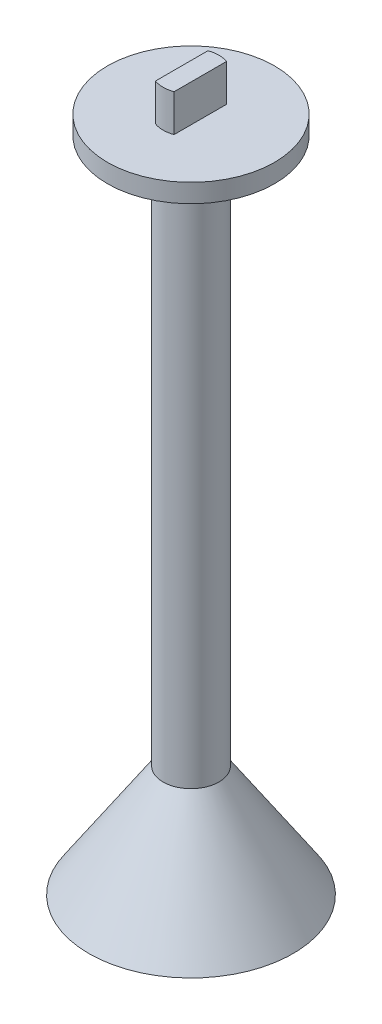
ISO-10303-21;
HEADER;
FILE_DESCRIPTION(('STEP AP214'),'2;1');
FILE_NAME('part.step','',(''),(''),'','','');
FILE_SCHEMA(('AUTOMOTIVE_DESIGN { 1 0 10303 214 1 1 1 1 }'));
ENDSEC;
DATA;
#1=APPLICATION_CONTEXT('core data for automotive mechanical design processes');
#2=APPLICATION_PROTOCOL_DEFINITION('international standard','automotive_design',2000,#1);
#3=PRODUCT_CONTEXT('',#1,'mechanical');
#4=PRODUCT('Part','Part','',(#3));
#5=PRODUCT_RELATED_PRODUCT_CATEGORY('part','',(#4));
#6=PRODUCT_DEFINITION_FORMATION('','',#4);
#7=PRODUCT_DEFINITION_CONTEXT('part definition',#1,'design');
#8=PRODUCT_DEFINITION('design','',#6,#7);
#9=PRODUCT_DEFINITION_SHAPE('','',#8);
#10=(LENGTH_UNIT() NAMED_UNIT(*) SI_UNIT(.MILLI.,.METRE.));
#11=(NAMED_UNIT(*) PLANE_ANGLE_UNIT() SI_UNIT($,.RADIAN.));
#12=(NAMED_UNIT(*) SI_UNIT($,.STERADIAN.) SOLID_ANGLE_UNIT());
#13=UNCERTAINTY_MEASURE_WITH_UNIT(LENGTH_MEASURE(1.E-05),#10,'distance_accuracy_value','');
#14=(GEOMETRIC_REPRESENTATION_CONTEXT(3) GLOBAL_UNCERTAINTY_ASSIGNED_CONTEXT((#13)) GLOBAL_UNIT_ASSIGNED_CONTEXT((#10,
#11,#12)) REPRESENTATION_CONTEXT('',''));
#15=CARTESIAN_POINT('',(0.,0.,0.));
#16=DIRECTION('',(0.,0.,1.));
#17=DIRECTION('',(1.,0.,0.));
#18=AXIS2_PLACEMENT_3D('',#15,#16,#17);
#19=CARTESIAN_POINT('',(0.,192.,0.));
#20=DIRECTION('',(0.,1.,0.));
#21=DIRECTION('',(0.,0.,1.));
#22=AXIS2_PLACEMENT_3D('',#19,#20,#21);
#23=PLANE('',#22);
#24=DIRECTION('',(0.,0.,1.));
#25=VECTOR('',#24,1.);
#26=CARTESIAN_POINT('',(2.5,192.,0.));
#27=LINE('',#26,#25);
#28=CARTESIAN_POINT('',(2.5,192.,-7.07106781186548));
#29=VERTEX_POINT('',#28);
#30=CARTESIAN_POINT('',(2.5,192.,7.07106781186548));
#31=VERTEX_POINT('',#30);
#32=EDGE_CURVE('E89',#29,#31,#27,.T.);
#33=ORIENTED_EDGE('',*,*,#32,.F.);
#34=CARTESIAN_POINT('',(0.,192.,0.));
#35=DIRECTION('',(0.,1.,0.));
#36=DIRECTION('',(0.,0.,1.));
#37=AXIS2_PLACEMENT_3D('',#34,#35,#36);
#38=CIRCLE('',#37,7.5);
#39=CARTESIAN_POINT('',(-2.5,192.,-7.07106781186548));
#40=VERTEX_POINT('',#39);
#41=EDGE_CURVE('E101',#29,#40,#38,.T.);
#42=ORIENTED_EDGE('',*,*,#41,.T.);
#43=DIRECTION('',(0.,0.,1.));
#44=VECTOR('',#43,1.);
#45=CARTESIAN_POINT('',(-2.5,192.,0.));
#46=LINE('',#45,#44);
#47=CARTESIAN_POINT('',(-2.5,192.,7.07106781186548));
#48=VERTEX_POINT('',#47);
#49=EDGE_CURVE('E220',#40,#48,#46,.T.);
#50=ORIENTED_EDGE('',*,*,#49,.T.);
#51=EDGE_CURVE('E103',#48,#31,#38,.T.);
#52=ORIENTED_EDGE('',*,*,#51,.T.);
#53=EDGE_LOOP('',(#33,#42,#50,#52));
#54=FACE_BOUND('',#53,.T.);
#55=ADVANCED_FACE('F44',(#54),#23,.T.);
#56=CARTESIAN_POINT('',(0.,192.,0.));
#57=DIRECTION('',(0.,-1.,0.));
#58=DIRECTION('',(0.,0.,-1.));
#59=AXIS2_PLACEMENT_3D('',#56,#57,#58);
#60=CYLINDRICAL_SURFACE('',#59,7.5);
#61=ORIENTED_EDGE('',*,*,#41,.F.);
#62=DIRECTION('',(0.,1.,0.));
#63=VECTOR('',#62,1.);
#64=CARTESIAN_POINT('',(2.5,182.,-7.07106781186548));
#65=LINE('',#64,#63);
#66=CARTESIAN_POINT('',(2.5,182.,-7.07106781186548));
#67=VERTEX_POINT('',#66);
#68=EDGE_CURVE('E86',#67,#29,#65,.T.);
#69=ORIENTED_EDGE('',*,*,#68,.F.);
#70=CARTESIAN_POINT('',(0.,182.,0.));
#71=DIRECTION('',(0.,1.,0.));
#72=DIRECTION('',(0.,0.,1.));
#73=AXIS2_PLACEMENT_3D('',#70,#71,#72);
#74=CIRCLE('',#73,7.5);
#75=CARTESIAN_POINT('',(-2.5,182.,-7.07106781186548));
#76=VERTEX_POINT('',#75);
#77=EDGE_CURVE('E117',#67,#76,#74,.T.);
#78=ORIENTED_EDGE('',*,*,#77,.T.);
#79=DIRECTION('',(0.,1.,0.));
#80=VECTOR('',#79,1.);
#81=CARTESIAN_POINT('',(-2.5,182.,-7.07106781186548));
#82=LINE('',#81,#80);
#83=EDGE_CURVE('E109',#76,#40,#82,.T.);
#84=ORIENTED_EDGE('',*,*,#83,.T.);
#85=EDGE_LOOP('',(#61,#69,#78,#84));
#86=FACE_BOUND('',#85,.T.);
#87=ADVANCED_FACE('F108',(#86),#60,.T.);
#88=CARTESIAN_POINT('',(-2.5,182.,7.07106781186548));
#89=VERTEX_POINT('',#88);
#90=CARTESIAN_POINT('',(2.5,182.,7.07106781186548));
#91=VERTEX_POINT('',#90);
#92=EDGE_CURVE('E49',#89,#91,#74,.T.);
#93=ORIENTED_EDGE('',*,*,#92,.T.);
#94=DIRECTION('',(0.,1.,0.));
#95=VECTOR('',#94,1.);
#96=CARTESIAN_POINT('',(2.5,182.,7.07106781186548));
#97=LINE('',#96,#95);
#98=EDGE_CURVE('E95',#91,#31,#97,.T.);
#99=ORIENTED_EDGE('',*,*,#98,.T.);
#100=ORIENTED_EDGE('',*,*,#51,.F.);
#101=DIRECTION('',(0.,1.,0.));
#102=VECTOR('',#101,1.);
#103=CARTESIAN_POINT('',(-2.5,182.,7.07106781186548));
#104=LINE('',#103,#102);
#105=EDGE_CURVE('E105',#89,#48,#104,.T.);
#106=ORIENTED_EDGE('',*,*,#105,.F.);
#107=EDGE_LOOP('',(#93,#99,#100,#106));
#108=FACE_BOUND('',#107,.T.);
#109=ADVANCED_FACE('F184',(#108),#60,.T.);
#110=CARTESIAN_POINT('',(0.,30.,0.));
#111=DIRECTION('',(0.,1.,0.));
#112=DIRECTION('',(0.,0.,1.));
#113=AXIS2_PLACEMENT_3D('',#110,#111,#112);
#114=CIRCLE('',#113,7.5);
#115=CARTESIAN_POINT('',(0.,30.,-7.5));
#116=VERTEX_POINT('',#115);
#117=EDGE_CURVE('E111',#116,#116,#114,.T.);
#118=ORIENTED_EDGE('',*,*,#117,.T.);
#119=EDGE_LOOP('',(#118));
#120=FACE_BOUND('',#119,.T.);
#121=CARTESIAN_POINT('',(0.,177.,0.));
#122=DIRECTION('',(0.,1.,0.));
#123=DIRECTION('',(0.,0.,1.));
#124=AXIS2_PLACEMENT_3D('',#121,#122,#123);
#125=CIRCLE('',#124,7.5);
#126=CARTESIAN_POINT('',(0.,177.,7.5));
#127=VERTEX_POINT('',#126);
#128=EDGE_CURVE('E12',#127,#127,#125,.T.);
#129=ORIENTED_EDGE('',*,*,#128,.F.);
#130=EDGE_LOOP('',(#129));
#131=FACE_BOUND('',#130,.T.);
#132=ADVANCED_FACE('F179',(#120,#131),#60,.T.);
#133=CARTESIAN_POINT('',(0.,0.,0.));
#134=DIRECTION('',(0.,1.,0.));
#135=DIRECTION('',(0.,0.,1.));
#136=AXIS2_PLACEMENT_3D('',#133,#134,#135);
#137=PLANE('',#136);
#138=CARTESIAN_POINT('',(0.,0.,0.));
#139=DIRECTION('',(0.,-1.,0.));
#140=DIRECTION('',(0.,0.,-1.));
#141=AXIS2_PLACEMENT_3D('',#138,#139,#140);
#142=CIRCLE('',#141,5.);
#143=CARTESIAN_POINT('',(0.,0.,-5.));
#144=VERTEX_POINT('',#143);
#145=EDGE_CURVE('E221',#144,#144,#142,.T.);
#146=ORIENTED_EDGE('',*,*,#145,.F.);
#147=EDGE_LOOP('',(#146));
#148=FACE_BOUND('',#147,.T.);
#149=CARTESIAN_POINT('',(0.,0.,0.));
#150=DIRECTION('',(0.,1.,0.));
#151=DIRECTION('',(0.,0.,1.));
#152=AXIS2_PLACEMENT_3D('',#149,#150,#151);
#153=CIRCLE('',#152,27.5);
#154=CARTESIAN_POINT('',(0.,0.,-27.5));
#155=VERTEX_POINT('',#154);
#156=EDGE_CURVE('E55',#155,#155,#153,.T.);
#157=ORIENTED_EDGE('',*,*,#156,.F.);
#158=EDGE_LOOP('',(#157));
#159=FACE_BOUND('',#158,.T.);
#160=ADVANCED_FACE('F46',(#148,#159),#137,.F.);
#161=CARTESIAN_POINT('',(0.,30.,0.));
#162=DIRECTION('',(0.,-1.,0.));
#163=DIRECTION('',(0.,0.,-1.));
#164=AXIS2_PLACEMENT_3D('',#161,#162,#163);
#165=CONICAL_SURFACE('',#164,7.5,0.588002603547568);
#166=CARTESIAN_POINT('',(0.,30.,-7.5));
#167=CARTESIAN_POINT('',(0.,29.6875,-7.70833333333334));
#168=CARTESIAN_POINT('',(0.,29.375,-7.91666666666667));
#169=CARTESIAN_POINT('',(0.,28.75,-8.33333333333334));
#170=CARTESIAN_POINT('',(0.,28.4375,-8.54166666666667));
#171=CARTESIAN_POINT('',(0.,27.8125,-8.95833333333333));
#172=CARTESIAN_POINT('',(0.,27.5,-9.16666666666667));
#173=CARTESIAN_POINT('',(0.,26.875,-9.58333333333333));
#174=CARTESIAN_POINT('',(0.,26.5625,-9.79166666666667));
#175=CARTESIAN_POINT('',(0.,25.9375,-10.2083333333333));
#176=CARTESIAN_POINT('',(0.,25.625,-10.4166666666667));
#177=CARTESIAN_POINT('',(0.,25.,-10.8333333333333));
#178=CARTESIAN_POINT('',(0.,24.6875,-11.0416666666667));
#179=CARTESIAN_POINT('',(0.,24.0625,-11.4583333333333));
#180=CARTESIAN_POINT('',(0.,23.75,-11.6666666666667));
#181=CARTESIAN_POINT('',(0.,23.125,-12.0833333333333));
#182=CARTESIAN_POINT('',(0.,22.8125,-12.2916666666667));
#183=CARTESIAN_POINT('',(0.,22.1875,-12.7083333333333));
#184=CARTESIAN_POINT('',(0.,21.875,-12.9166666666667));
#185=CARTESIAN_POINT('',(0.,21.25,-13.3333333333333));
#186=CARTESIAN_POINT('',(0.,20.9375,-13.5416666666667));
#187=CARTESIAN_POINT('',(0.,20.3125,-13.9583333333333));
#188=CARTESIAN_POINT('',(0.,20.,-14.1666666666667));
#189=CARTESIAN_POINT('',(0.,19.375,-14.5833333333333));
#190=CARTESIAN_POINT('',(0.,19.0625,-14.7916666666667));
#191=CARTESIAN_POINT('',(0.,18.4375,-15.2083333333333));
#192=CARTESIAN_POINT('',(0.,18.125,-15.4166666666667));
#193=CARTESIAN_POINT('',(0.,17.5,-15.8333333333333));
#194=CARTESIAN_POINT('',(0.,17.1875,-16.0416666666667));
#195=CARTESIAN_POINT('',(0.,16.5625,-16.4583333333333));
#196=CARTESIAN_POINT('',(0.,16.25,-16.6666666666667));
#197=CARTESIAN_POINT('',(0.,15.625,-17.0833333333333));
#198=CARTESIAN_POINT('',(0.,15.3125,-17.2916666666667));
#199=CARTESIAN_POINT('',(0.,14.6875,-17.7083333333333));
#200=CARTESIAN_POINT('',(0.,14.375,-17.9166666666667));
#201=CARTESIAN_POINT('',(0.,13.75,-18.3333333333333));
#202=CARTESIAN_POINT('',(0.,13.4375,-18.5416666666667));
#203=CARTESIAN_POINT('',(0.,12.8125,-18.9583333333333));
#204=CARTESIAN_POINT('',(0.,12.5,-19.1666666666667));
#205=CARTESIAN_POINT('',(0.,11.875,-19.5833333333333));
#206=CARTESIAN_POINT('',(0.,11.5625,-19.7916666666667));
#207=CARTESIAN_POINT('',(0.,10.9375,-20.2083333333333));
#208=CARTESIAN_POINT('',(0.,10.625,-20.4166666666667));
#209=CARTESIAN_POINT('',(0.,10.,-20.8333333333333));
#210=CARTESIAN_POINT('',(0.,9.6875,-21.0416666666667));
#211=CARTESIAN_POINT('',(0.,9.0625,-21.4583333333333));
#212=CARTESIAN_POINT('',(0.,8.75,-21.6666666666667));
#213=CARTESIAN_POINT('',(0.,8.125,-22.0833333333333));
#214=CARTESIAN_POINT('',(0.,7.8125,-22.2916666666667));
#215=CARTESIAN_POINT('',(0.,7.1875,-22.7083333333333));
#216=CARTESIAN_POINT('',(0.,6.875,-22.9166666666667));
#217=CARTESIAN_POINT('',(0.,6.25,-23.3333333333333));
#218=CARTESIAN_POINT('',(0.,5.9375,-23.5416666666667));
#219=CARTESIAN_POINT('',(0.,5.3125,-23.9583333333333));
#220=CARTESIAN_POINT('',(0.,5.,-24.1666666666667));
#221=CARTESIAN_POINT('',(0.,4.375,-24.5833333333333));
#222=CARTESIAN_POINT('',(0.,4.0625,-24.7916666666667));
#223=CARTESIAN_POINT('',(0.,3.4375,-25.2083333333333));
#224=CARTESIAN_POINT('',(0.,3.125,-25.4166666666667));
#225=CARTESIAN_POINT('',(0.,2.5,-25.8333333333333));
#226=CARTESIAN_POINT('',(0.,2.1875,-26.0416666666667));
#227=CARTESIAN_POINT('',(0.,1.5625,-26.4583333333333));
#228=CARTESIAN_POINT('',(0.,1.25,-26.6666666666667));
#229=CARTESIAN_POINT('',(0.,0.625,-27.0833333333333));
#230=CARTESIAN_POINT('',(0.,0.3125,-27.2916666666667));
#231=CARTESIAN_POINT('',(0.,0.,-27.5));
#232=B_SPLINE_CURVE_WITH_KNOTS('',3,(#166,#167,#168,#169,#170,#171,#172,#173,#174,#175,#176,
#177,#178,#179,#180,#181,#182,#183,#184,#185,#186,#187,#188,#189,#190,#191,#192,#193,#194,#195,
#196,#197,#198,#199,#200,#201,#202,#203,#204,#205,#206,#207,#208,#209,#210,#211,#212,#213,#214,
#215,#216,#217,#218,#219,#220,#221,#222,#223,#224,#225,#226,#227,#228,#229,#230,#231),
.UNSPECIFIED.,.F.,.F.,(4,2,2,2,2,2,2,2,2,2,2,2,2,2,2,2,2,2,2,2,2,2,2,2,2,2,2,2,2,2,2,2,4),(0.,
1.12673477358249,2.25346954716499,3.38020432074749,4.50693909432998,5.63367386791248,
6.76040864149498,7.88714341507747,9.01387818865997,10.1406129622425,11.267347735825,
12.3940825094075,13.52081728299,14.6475520565725,15.7742868301549,16.9010216037374,
18.0277563773199,19.1544911509024,20.2812259244849,21.4079606980674,22.5346954716499,
23.6614302452324,24.7881650188149,25.9148997923974,27.0416345659799,28.1683693395624,
29.2951041131449,30.4218388867274,31.5485736603099,32.6753084338924,33.8020432074749,
34.9287779810574,36.0555127546399),.UNSPECIFIED.);
#233=EDGE_CURVE('BSEAM130',#116,#155,#232,.T.);
#234=ORIENTED_EDGE('',*,*,#117,.F.);
#235=ORIENTED_EDGE('',*,*,#156,.T.);
#236=ORIENTED_EDGE('',*,*,#233,.T.);
#237=ORIENTED_EDGE('',*,*,#233,.F.);
#238=EDGE_LOOP('',(#234,#236,#235,#237));
#239=FACE_BOUND('',#238,.T.);
#240=ADVANCED_FACE('F130',(#239),#165,.T.);
#241=CARTESIAN_POINT('',(0.,182.,0.));
#242=DIRECTION('',(0.,-1.,0.));
#243=DIRECTION('',(0.,0.,-1.));
#244=AXIS2_PLACEMENT_3D('',#241,#242,#243);
#245=CYLINDRICAL_SURFACE('',#244,22.5);
#246=CARTESIAN_POINT('',(0.,182.,0.));
#247=DIRECTION('',(0.,1.,0.));
#248=DIRECTION('',(0.,0.,1.));
#249=AXIS2_PLACEMENT_3D('',#246,#247,#248);
#250=CIRCLE('',#249,22.5);
#251=CARTESIAN_POINT('',(0.,182.,22.5));
#252=VERTEX_POINT('',#251);
#253=EDGE_CURVE('E238',#252,#252,#250,.T.);
#254=ORIENTED_EDGE('',*,*,#253,.F.);
#255=EDGE_LOOP('',(#254));
#256=FACE_BOUND('',#255,.T.);
#257=CARTESIAN_POINT('',(0.,177.,0.));
#258=DIRECTION('',(0.,1.,0.));
#259=DIRECTION('',(0.,0.,1.));
#260=AXIS2_PLACEMENT_3D('',#257,#258,#259);
#261=CIRCLE('',#260,22.5);
#262=CARTESIAN_POINT('',(0.,177.,22.5));
#263=VERTEX_POINT('',#262);
#264=EDGE_CURVE('E120',#263,#263,#261,.T.);
#265=ORIENTED_EDGE('',*,*,#264,.T.);
#266=EDGE_LOOP('',(#265));
#267=FACE_BOUND('',#266,.T.);
#268=ADVANCED_FACE('F139',(#256,#267),#245,.T.);
#269=CARTESIAN_POINT('',(0.,182.,0.));
#270=DIRECTION('',(0.,1.,0.));
#271=DIRECTION('',(0.,0.,1.));
#272=AXIS2_PLACEMENT_3D('',#269,#270,#271);
#273=PLANE('',#272);
#274=ORIENTED_EDGE('',*,*,#77,.F.);
#275=DIRECTION('',(0.,0.,1.));
#276=VECTOR('',#275,1.);
#277=CARTESIAN_POINT('',(2.5,182.,0.));
#278=LINE('',#277,#276);
#279=EDGE_CURVE('E67',#67,#91,#278,.T.);
#280=ORIENTED_EDGE('',*,*,#279,.T.);
#281=ORIENTED_EDGE('',*,*,#92,.F.);
#282=DIRECTION('',(0.,0.,1.));
#283=VECTOR('',#282,1.);
#284=CARTESIAN_POINT('',(-2.5,182.,0.));
#285=LINE('',#284,#283);
#286=EDGE_CURVE('E62',#76,#89,#285,.T.);
#287=ORIENTED_EDGE('',*,*,#286,.F.);
#288=EDGE_LOOP('',(#274,#280,#281,#287));
#289=FACE_BOUND('',#288,.T.);
#290=ORIENTED_EDGE('',*,*,#253,.T.);
#291=EDGE_LOOP('',(#290));
#292=FACE_BOUND('',#291,.T.);
#293=ADVANCED_FACE('F193',(#289,#292),#273,.T.);
#294=CARTESIAN_POINT('',(0.,177.,0.));
#295=DIRECTION('',(0.,1.,0.));
#296=DIRECTION('',(0.,0.,1.));
#297=AXIS2_PLACEMENT_3D('',#294,#295,#296);
#298=PLANE('',#297);
#299=ORIENTED_EDGE('',*,*,#128,.T.);
#300=EDGE_LOOP('',(#299));
#301=FACE_BOUND('',#300,.T.);
#302=ORIENTED_EDGE('',*,*,#264,.F.);
#303=EDGE_LOOP('',(#302));
#304=FACE_BOUND('',#303,.T.);
#305=ADVANCED_FACE('F195',(#301,#304),#298,.F.);
#306=CARTESIAN_POINT('',(-2.5,182.,0.));
#307=DIRECTION('',(-1.,0.,0.));
#308=DIRECTION('',(0.,0.,1.));
#309=AXIS2_PLACEMENT_3D('',#306,#307,#308);
#310=PLANE('',#309);
#311=ORIENTED_EDGE('',*,*,#49,.F.);
#312=ORIENTED_EDGE('',*,*,#83,.F.);
#313=ORIENTED_EDGE('',*,*,#286,.T.);
#314=ORIENTED_EDGE('',*,*,#105,.T.);
#315=EDGE_LOOP('',(#311,#312,#313,#314));
#316=FACE_BOUND('',#315,.T.);
#317=ADVANCED_FACE('F198',(#316),#310,.T.);
#318=CARTESIAN_POINT('',(2.5,182.,0.));
#319=DIRECTION('',(-1.,0.,0.));
#320=DIRECTION('',(0.,0.,1.));
#321=AXIS2_PLACEMENT_3D('',#318,#319,#320);
#322=PLANE('',#321);
#323=ORIENTED_EDGE('',*,*,#32,.T.);
#324=ORIENTED_EDGE('',*,*,#98,.F.);
#325=ORIENTED_EDGE('',*,*,#279,.F.);
#326=ORIENTED_EDGE('',*,*,#68,.T.);
#327=EDGE_LOOP('',(#323,#324,#325,#326));
#328=FACE_BOUND('',#327,.T.);
#329=ADVANCED_FACE('F88',(#328),#322,.F.);
#330=CARTESIAN_POINT('',(0.,20.,0.));
#331=DIRECTION('',(0.,-1.,0.));
#332=DIRECTION('',(0.,0.,-1.));
#333=AXIS2_PLACEMENT_3D('',#330,#331,#332);
#334=CYLINDRICAL_SURFACE('',#333,5.);
#335=CARTESIAN_POINT('',(0.,20.,0.));
#336=DIRECTION('',(0.,-1.,0.));
#337=DIRECTION('',(0.,0.,-1.));
#338=AXIS2_PLACEMENT_3D('',#335,#336,#337);
#339=CIRCLE('',#338,5.);
#340=CARTESIAN_POINT('',(0.,20.,-5.));
#341=VERTEX_POINT('',#340);
#342=EDGE_CURVE('E218',#341,#341,#339,.T.);
#343=ORIENTED_EDGE('',*,*,#342,.F.);
#344=EDGE_LOOP('',(#343));
#345=FACE_BOUND('',#344,.T.);
#346=ORIENTED_EDGE('',*,*,#145,.T.);
#347=EDGE_LOOP('',(#346));
#348=FACE_BOUND('',#347,.T.);
#349=ADVANCED_FACE('F207',(#345,#348),#334,.F.);
#350=CARTESIAN_POINT('',(0.,20.,0.));
#351=DIRECTION('',(0.,-1.,0.));
#352=DIRECTION('',(0.,0.,-1.));
#353=AXIS2_PLACEMENT_3D('',#350,#351,#352);
#354=PLANE('',#353);
#355=ORIENTED_EDGE('',*,*,#342,.T.);
#356=EDGE_LOOP('',(#355));
#357=FACE_BOUND('',#356,.T.);
#358=ADVANCED_FACE('F210',(#357),#354,.T.);
#359=CLOSED_SHELL('',(#55,#87,#109,#132,#160,#240,#268,#293,#305,#317,#329,#349,#358));
#360=MANIFOLD_SOLID_BREP('B2',#359);
#361=ADVANCED_BREP_SHAPE_REPRESENTATION('',(#18,#360),#14);
#362=SHAPE_DEFINITION_REPRESENTATION(#9,#361);
ENDSEC;
END-ISO-10303-21;
